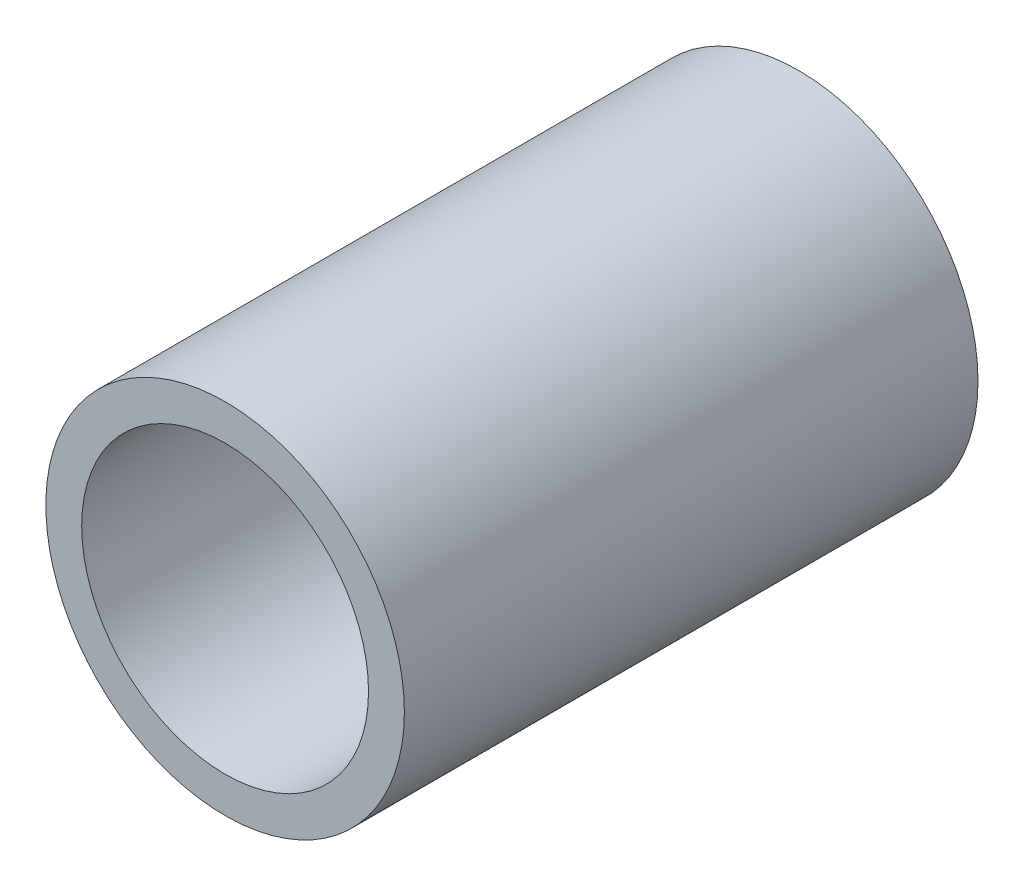
ISO-10303-21;
HEADER;
FILE_DESCRIPTION(('STEP AP214'),'2;1');
FILE_NAME('part.step','',(''),(''),'','','');
FILE_SCHEMA(('AUTOMOTIVE_DESIGN { 1 0 10303 214 1 1 1 1 }'));
ENDSEC;
DATA;
#1=APPLICATION_CONTEXT('core data for automotive mechanical design processes');
#2=APPLICATION_PROTOCOL_DEFINITION('international standard','automotive_design',2000,#1);
#3=PRODUCT_CONTEXT('',#1,'mechanical');
#4=PRODUCT('Part','Part','',(#3));
#5=PRODUCT_RELATED_PRODUCT_CATEGORY('part','',(#4));
#6=PRODUCT_DEFINITION_FORMATION('','',#4);
#7=PRODUCT_DEFINITION_CONTEXT('part definition',#1,'design');
#8=PRODUCT_DEFINITION('design','',#6,#7);
#9=PRODUCT_DEFINITION_SHAPE('','',#8);
#10=(LENGTH_UNIT() NAMED_UNIT(*) SI_UNIT(.MILLI.,.METRE.));
#11=(NAMED_UNIT(*) PLANE_ANGLE_UNIT() SI_UNIT($,.RADIAN.));
#12=(NAMED_UNIT(*) SI_UNIT($,.STERADIAN.) SOLID_ANGLE_UNIT());
#13=UNCERTAINTY_MEASURE_WITH_UNIT(LENGTH_MEASURE(1.E-05),#10,'distance_accuracy_value','');
#14=(GEOMETRIC_REPRESENTATION_CONTEXT(3) GLOBAL_UNCERTAINTY_ASSIGNED_CONTEXT((#13)) GLOBAL_UNIT_ASSIGNED_CONTEXT((#10,
#11,#12)) REPRESENTATION_CONTEXT('',''));
#15=CARTESIAN_POINT('',(0.,0.,0.));
#16=DIRECTION('',(0.,0.,1.));
#17=DIRECTION('',(1.,0.,0.));
#18=AXIS2_PLACEMENT_3D('',#15,#16,#17);
#19=CARTESIAN_POINT('',(-3.47396725551691,0.,-2.032));
#20=DIRECTION('',(0.,0.,1.));
#21=DIRECTION('',(1.,0.,0.));
#22=AXIS2_PLACEMENT_3D('',#19,#20,#21);
#23=CYLINDRICAL_SURFACE('',#22,0.63499999999999);
#24=CARTESIAN_POINT('',(-3.47396725551691,0.,-2.032));
#25=DIRECTION('',(0.,0.,1.));
#26=DIRECTION('',(1.,0.,0.));
#27=AXIS2_PLACEMENT_3D('',#24,#25,#26);
#28=CIRCLE('',#27,0.63499999999999);
#29=CARTESIAN_POINT('',(-2.83896725551692,0.,-2.032));
#30=VERTEX_POINT('',#29);
#31=EDGE_CURVE('E10',#30,#30,#28,.T.);
#32=ORIENTED_EDGE('',*,*,#31,.T.);
#33=EDGE_LOOP('',(#32));
#34=FACE_BOUND('',#33,.T.);
#35=CARTESIAN_POINT('',(-3.47396725551691,0.,0.));
#36=DIRECTION('',(0.,0.,1.));
#37=DIRECTION('',(1.,0.,0.));
#38=AXIS2_PLACEMENT_3D('',#35,#36,#37);
#39=CIRCLE('',#38,0.63499999999999);
#40=CARTESIAN_POINT('',(-2.83896725551692,0.,0.));
#41=VERTEX_POINT('',#40);
#42=EDGE_CURVE('E44',#41,#41,#39,.T.);
#43=ORIENTED_EDGE('',*,*,#42,.F.);
#44=EDGE_LOOP('',(#43));
#45=FACE_BOUND('',#44,.T.);
#46=ADVANCED_FACE('F41',(#34,#45),#23,.T.);
#47=CARTESIAN_POINT('',(-3.47396725551691,0.,-2.032));
#48=DIRECTION('',(0.,0.,1.));
#49=DIRECTION('',(1.,0.,0.));
#50=AXIS2_PLACEMENT_3D('',#47,#48,#49);
#51=PLANE('',#50);
#52=CARTESIAN_POINT('',(-3.47396725551691,0.,-2.032));
#53=DIRECTION('',(0.,0.,1.));
#54=DIRECTION('',(1.,0.,0.));
#55=AXIS2_PLACEMENT_3D('',#52,#53,#54);
#56=CIRCLE('',#55,0.508000000000001);
#57=CARTESIAN_POINT('',(-2.96596725551691,0.,-2.032));
#58=VERTEX_POINT('',#57);
#59=EDGE_CURVE('E53',#58,#58,#56,.T.);
#60=ORIENTED_EDGE('',*,*,#59,.T.);
#61=EDGE_LOOP('',(#60));
#62=FACE_BOUND('',#61,.T.);
#63=ORIENTED_EDGE('',*,*,#31,.F.);
#64=EDGE_LOOP('',(#63));
#65=FACE_BOUND('',#64,.T.);
#66=ADVANCED_FACE('F63',(#62,#65),#51,.F.);
#67=CARTESIAN_POINT('',(-3.47396725551691,0.,0.));
#68=DIRECTION('',(0.,0.,1.));
#69=DIRECTION('',(1.,0.,0.));
#70=AXIS2_PLACEMENT_3D('',#67,#68,#69);
#71=PLANE('',#70);
#72=CARTESIAN_POINT('',(-3.47396725551691,0.,0.));
#73=DIRECTION('',(0.,0.,1.));
#74=DIRECTION('',(1.,0.,0.));
#75=AXIS2_PLACEMENT_3D('',#72,#73,#74);
#76=CIRCLE('',#75,0.508000000000001);
#77=CARTESIAN_POINT('',(-2.96596725551691,0.,0.));
#78=VERTEX_POINT('',#77);
#79=EDGE_CURVE('E55',#78,#78,#76,.T.);
#80=ORIENTED_EDGE('',*,*,#79,.F.);
#81=EDGE_LOOP('',(#80));
#82=FACE_BOUND('',#81,.T.);
#83=ORIENTED_EDGE('',*,*,#42,.T.);
#84=EDGE_LOOP('',(#83));
#85=FACE_BOUND('',#84,.T.);
#86=ADVANCED_FACE('F69',(#82,#85),#71,.T.);
#87=CARTESIAN_POINT('',(-3.47396725551691,0.,-2.032));
#88=DIRECTION('',(0.,0.,1.));
#89=DIRECTION('',(1.,0.,0.));
#90=AXIS2_PLACEMENT_3D('',#87,#88,#89);
#91=CYLINDRICAL_SURFACE('',#90,0.508000000000001);
#92=ORIENTED_EDGE('',*,*,#59,.F.);
#93=EDGE_LOOP('',(#92));
#94=FACE_BOUND('',#93,.T.);
#95=ORIENTED_EDGE('',*,*,#79,.T.);
#96=EDGE_LOOP('',(#95));
#97=FACE_BOUND('',#96,.T.);
#98=ADVANCED_FACE('F66',(#94,#97),#91,.F.);
#99=CLOSED_SHELL('',(#46,#66,#86,#98));
#100=MANIFOLD_SOLID_BREP('B2',#99);
#101=ADVANCED_BREP_SHAPE_REPRESENTATION('',(#18,#100),#14);
#102=SHAPE_DEFINITION_REPRESENTATION(#9,#101);
ENDSEC;
END-ISO-10303-21;
